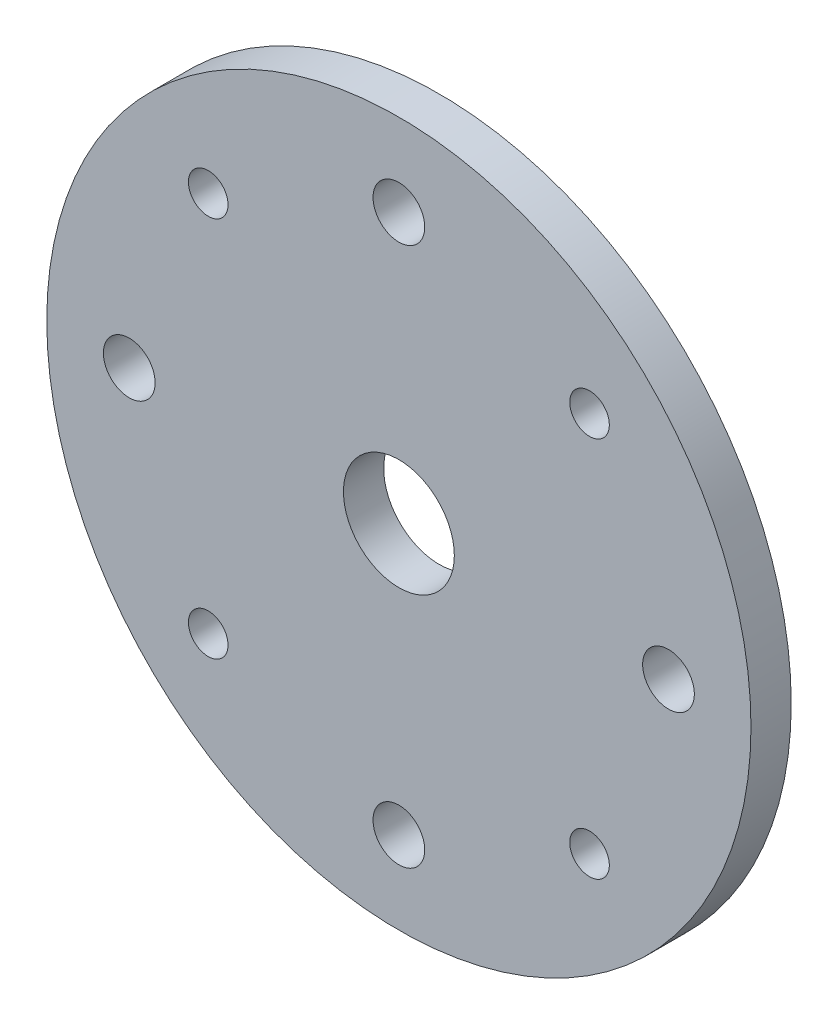
ISO-10303-21;
HEADER;
FILE_DESCRIPTION(('STEP AP214'),'2;1');
FILE_NAME('part.step','',(''),(''),'','','');
FILE_SCHEMA(('AUTOMOTIVE_DESIGN { 1 0 10303 214 1 1 1 1 }'));
ENDSEC;
DATA;
#1=APPLICATION_CONTEXT('core data for automotive mechanical design processes');
#2=APPLICATION_PROTOCOL_DEFINITION('international standard','automotive_design',2000,#1);
#3=PRODUCT_CONTEXT('',#1,'mechanical');
#4=PRODUCT('Part','Part','',(#3));
#5=PRODUCT_RELATED_PRODUCT_CATEGORY('part','',(#4));
#6=PRODUCT_DEFINITION_FORMATION('','',#4);
#7=PRODUCT_DEFINITION_CONTEXT('part definition',#1,'design');
#8=PRODUCT_DEFINITION('design','',#6,#7);
#9=PRODUCT_DEFINITION_SHAPE('','',#8);
#10=(LENGTH_UNIT() NAMED_UNIT(*) SI_UNIT(.MILLI.,.METRE.));
#11=(NAMED_UNIT(*) PLANE_ANGLE_UNIT() SI_UNIT($,.RADIAN.));
#12=(NAMED_UNIT(*) SI_UNIT($,.STERADIAN.) SOLID_ANGLE_UNIT());
#13=UNCERTAINTY_MEASURE_WITH_UNIT(LENGTH_MEASURE(1.E-05),#10,'distance_accuracy_value','');
#14=(GEOMETRIC_REPRESENTATION_CONTEXT(3) GLOBAL_UNCERTAINTY_ASSIGNED_CONTEXT((#13)) GLOBAL_UNIT_ASSIGNED_CONTEXT((#10,
#11,#12)) REPRESENTATION_CONTEXT('',''));
#15=CARTESIAN_POINT('',(0.,0.,0.));
#16=DIRECTION('',(0.,0.,1.));
#17=DIRECTION('',(1.,0.,0.));
#18=AXIS2_PLACEMENT_3D('',#15,#16,#17);
#19=CARTESIAN_POINT('',(0.,0.,5.08));
#20=DIRECTION('',(0.,0.,1.));
#21=DIRECTION('',(1.,0.,0.));
#22=AXIS2_PLACEMENT_3D('',#19,#20,#21);
#23=PLANE('',#22);
#24=CARTESIAN_POINT('',(-24.0670864044629,-24.0670864044664,5.08));
#25=DIRECTION('',(0.,0.,1.));
#26=DIRECTION('',(1.,0.,0.));
#27=AXIS2_PLACEMENT_3D('',#24,#25,#26);
#28=CIRCLE('',#27,2.50000000000295);
#29=CARTESIAN_POINT('',(-21.5670864044599,-24.0670864044664,5.08));
#30=VERTEX_POINT('',#29);
#31=EDGE_CURVE('E82',#30,#30,#28,.T.);
#32=ORIENTED_EDGE('',*,*,#31,.F.);
#33=EDGE_LOOP('',(#32));
#34=FACE_BOUND('',#33,.T.);
#35=CARTESIAN_POINT('',(24.0670864044658,24.0670864044664,5.08));
#36=DIRECTION('',(0.,0.,1.));
#37=DIRECTION('',(1.,0.,0.));
#38=AXIS2_PLACEMENT_3D('',#35,#36,#37);
#39=CIRCLE('',#38,2.50000000000017);
#40=CARTESIAN_POINT('',(26.5670864044659,24.0670864044664,5.08));
#41=VERTEX_POINT('',#40);
#42=EDGE_CURVE('E70',#41,#41,#39,.T.);
#43=ORIENTED_EDGE('',*,*,#42,.F.);
#44=EDGE_LOOP('',(#43));
#45=FACE_BOUND('',#44,.T.);
#46=CARTESIAN_POINT('',(2.89374749082854E-12,-34.036,5.08));
#47=DIRECTION('',(0.,0.,1.));
#48=DIRECTION('',(1.,0.,0.));
#49=AXIS2_PLACEMENT_3D('',#46,#47,#48);
#50=CIRCLE('',#49,3.2639);
#51=CARTESIAN_POINT('',(3.2639000000029,-34.036,5.08));
#52=VERTEX_POINT('',#51);
#53=EDGE_CURVE('E58',#52,#52,#50,.T.);
#54=ORIENTED_EDGE('',*,*,#53,.F.);
#55=EDGE_LOOP('',(#54));
#56=FACE_BOUND('',#55,.T.);
#57=CARTESIAN_POINT('',(0.,34.036,5.08));
#58=DIRECTION('',(0.,0.,1.));
#59=DIRECTION('',(1.,0.,0.));
#60=AXIS2_PLACEMENT_3D('',#57,#58,#59);
#61=CIRCLE('',#60,3.2639);
#62=CARTESIAN_POINT('',(3.2639,34.036,5.08));
#63=VERTEX_POINT('',#62);
#64=EDGE_CURVE('E46',#63,#63,#61,.T.);
#65=ORIENTED_EDGE('',*,*,#64,.F.);
#66=EDGE_LOOP('',(#65));
#67=FACE_BOUND('',#66,.T.);
#68=CARTESIAN_POINT('',(0.,0.,5.08));
#69=DIRECTION('',(0.,0.,1.));
#70=DIRECTION('',(1.,0.,0.));
#71=AXIS2_PLACEMENT_3D('',#68,#69,#70);
#72=CIRCLE('',#71,44.45);
#73=CARTESIAN_POINT('',(44.45,0.,5.08));
#74=VERTEX_POINT('',#73);
#75=EDGE_CURVE('E10',#74,#74,#72,.T.);
#76=ORIENTED_EDGE('',*,*,#75,.T.);
#77=EDGE_LOOP('',(#76));
#78=FACE_BOUND('',#77,.T.);
#79=CARTESIAN_POINT('',(0.,0.,5.08));
#80=DIRECTION('',(0.,0.,1.));
#81=DIRECTION('',(1.,0.,0.));
#82=AXIS2_PLACEMENT_3D('',#79,#80,#81);
#83=CIRCLE('',#82,6.9999987);
#84=CARTESIAN_POINT('',(6.9999987,0.,5.08));
#85=VERTEX_POINT('',#84);
#86=EDGE_CURVE('E41',#85,#85,#83,.T.);
#87=ORIENTED_EDGE('',*,*,#86,.F.);
#88=EDGE_LOOP('',(#87));
#89=FACE_BOUND('',#88,.T.);
#90=CARTESIAN_POINT('',(34.0360000000014,1.44687374541427E-12,5.08));
#91=DIRECTION('',(0.,0.,1.));
#92=DIRECTION('',(1.,0.,0.));
#93=AXIS2_PLACEMENT_3D('',#90,#91,#92);
#94=CIRCLE('',#93,3.2639);
#95=CARTESIAN_POINT('',(37.2999000000015,1.44687374541427E-12,5.08));
#96=VERTEX_POINT('',#95);
#97=EDGE_CURVE('E52',#96,#96,#94,.T.);
#98=ORIENTED_EDGE('',*,*,#97,.F.);
#99=EDGE_LOOP('',(#98));
#100=FACE_BOUND('',#99,.T.);
#101=CARTESIAN_POINT('',(-34.0359999999986,-1.45104195325985E-12,5.08));
#102=DIRECTION('',(0.,0.,1.));
#103=DIRECTION('',(1.,0.,0.));
#104=AXIS2_PLACEMENT_3D('',#101,#102,#103);
#105=CIRCLE('',#104,3.2639);
#106=CARTESIAN_POINT('',(-30.7720999999986,-1.45104195325985E-12,5.08));
#107=VERTEX_POINT('',#106);
#108=EDGE_CURVE('E64',#107,#107,#105,.T.);
#109=ORIENTED_EDGE('',*,*,#108,.F.);
#110=EDGE_LOOP('',(#109));
#111=FACE_BOUND('',#110,.T.);
#112=CARTESIAN_POINT('',(24.0670864044678,-24.0670864044643,5.08));
#113=DIRECTION('',(0.,0.,1.));
#114=DIRECTION('',(1.,0.,0.));
#115=AXIS2_PLACEMENT_3D('',#112,#113,#114);
#116=CIRCLE('',#115,2.50000000000224);
#117=CARTESIAN_POINT('',(26.56708640447,-24.0670864044643,5.08));
#118=VERTEX_POINT('',#117);
#119=EDGE_CURVE('E76',#118,#118,#116,.T.);
#120=ORIENTED_EDGE('',*,*,#119,.F.);
#121=EDGE_LOOP('',(#120));
#122=FACE_BOUND('',#121,.T.);
#123=CARTESIAN_POINT('',(-24.0670864044649,24.0670864044643,5.08));
#124=DIRECTION('',(0.,0.,1.));
#125=DIRECTION('',(1.,0.,0.));
#126=AXIS2_PLACEMENT_3D('',#123,#124,#125);
#127=CIRCLE('',#126,2.50000000000111);
#128=CARTESIAN_POINT('',(-21.5670864044638,24.0670864044643,5.08));
#129=VERTEX_POINT('',#128);
#130=EDGE_CURVE('E88',#129,#129,#127,.T.);
#131=ORIENTED_EDGE('',*,*,#130,.F.);
#132=EDGE_LOOP('',(#131));
#133=FACE_BOUND('',#132,.T.);
#134=ADVANCED_FACE('F30',(#34,#45,#56,#67,#78,#89,#100,#111,#122,#133),#23,.T.);
#135=CARTESIAN_POINT('',(0.,0.,0.));
#136=DIRECTION('',(0.,0.,1.));
#137=DIRECTION('',(1.,0.,0.));
#138=AXIS2_PLACEMENT_3D('',#135,#136,#137);
#139=PLANE('',#138);
#140=CARTESIAN_POINT('',(0.,0.,0.));
#141=DIRECTION('',(0.,0.,1.));
#142=DIRECTION('',(1.,0.,0.));
#143=AXIS2_PLACEMENT_3D('',#140,#141,#142);
#144=CIRCLE('',#143,44.45);
#145=CARTESIAN_POINT('',(44.45,0.,0.));
#146=VERTEX_POINT('',#145);
#147=EDGE_CURVE('E34',#146,#146,#144,.T.);
#148=ORIENTED_EDGE('',*,*,#147,.F.);
#149=EDGE_LOOP('',(#148));
#150=FACE_BOUND('',#149,.T.);
#151=CARTESIAN_POINT('',(0.,0.,0.));
#152=DIRECTION('',(0.,0.,1.));
#153=DIRECTION('',(1.,0.,0.));
#154=AXIS2_PLACEMENT_3D('',#151,#152,#153);
#155=CIRCLE('',#154,6.9999987);
#156=CARTESIAN_POINT('',(6.9999987,0.,0.));
#157=VERTEX_POINT('',#156);
#158=EDGE_CURVE('E43',#157,#157,#155,.T.);
#159=ORIENTED_EDGE('',*,*,#158,.T.);
#160=EDGE_LOOP('',(#159));
#161=FACE_BOUND('',#160,.T.);
#162=CARTESIAN_POINT('',(0.,34.036,0.));
#163=DIRECTION('',(0.,0.,1.));
#164=DIRECTION('',(1.,0.,0.));
#165=AXIS2_PLACEMENT_3D('',#162,#163,#164);
#166=CIRCLE('',#165,3.2639);
#167=CARTESIAN_POINT('',(3.2639,34.036,0.));
#168=VERTEX_POINT('',#167);
#169=EDGE_CURVE('E49',#168,#168,#166,.T.);
#170=ORIENTED_EDGE('',*,*,#169,.T.);
#171=EDGE_LOOP('',(#170));
#172=FACE_BOUND('',#171,.T.);
#173=CARTESIAN_POINT('',(34.0360000000014,1.44687374541427E-12,0.));
#174=DIRECTION('',(0.,0.,1.));
#175=DIRECTION('',(1.,0.,0.));
#176=AXIS2_PLACEMENT_3D('',#173,#174,#175);
#177=CIRCLE('',#176,3.2639);
#178=CARTESIAN_POINT('',(37.2999000000015,1.44687374541427E-12,0.));
#179=VERTEX_POINT('',#178);
#180=EDGE_CURVE('E55',#179,#179,#177,.T.);
#181=ORIENTED_EDGE('',*,*,#180,.T.);
#182=EDGE_LOOP('',(#181));
#183=FACE_BOUND('',#182,.T.);
#184=CARTESIAN_POINT('',(2.89374749082854E-12,-34.036,0.));
#185=DIRECTION('',(0.,0.,1.));
#186=DIRECTION('',(1.,0.,0.));
#187=AXIS2_PLACEMENT_3D('',#184,#185,#186);
#188=CIRCLE('',#187,3.2639);
#189=CARTESIAN_POINT('',(3.2639000000029,-34.036,0.));
#190=VERTEX_POINT('',#189);
#191=EDGE_CURVE('E61',#190,#190,#188,.T.);
#192=ORIENTED_EDGE('',*,*,#191,.T.);
#193=EDGE_LOOP('',(#192));
#194=FACE_BOUND('',#193,.T.);
#195=CARTESIAN_POINT('',(-34.0359999999986,-1.45104195325985E-12,0.));
#196=DIRECTION('',(0.,0.,1.));
#197=DIRECTION('',(1.,0.,0.));
#198=AXIS2_PLACEMENT_3D('',#195,#196,#197);
#199=CIRCLE('',#198,3.2639);
#200=CARTESIAN_POINT('',(-30.7720999999986,-1.45104195325985E-12,0.));
#201=VERTEX_POINT('',#200);
#202=EDGE_CURVE('E67',#201,#201,#199,.T.);
#203=ORIENTED_EDGE('',*,*,#202,.T.);
#204=EDGE_LOOP('',(#203));
#205=FACE_BOUND('',#204,.T.);
#206=CARTESIAN_POINT('',(24.0670864044658,24.0670864044664,0.));
#207=DIRECTION('',(0.,0.,1.));
#208=DIRECTION('',(1.,0.,0.));
#209=AXIS2_PLACEMENT_3D('',#206,#207,#208);
#210=CIRCLE('',#209,2.50000000000017);
#211=CARTESIAN_POINT('',(26.5670864044659,24.0670864044664,0.));
#212=VERTEX_POINT('',#211);
#213=EDGE_CURVE('E73',#212,#212,#210,.T.);
#214=ORIENTED_EDGE('',*,*,#213,.T.);
#215=EDGE_LOOP('',(#214));
#216=FACE_BOUND('',#215,.T.);
#217=CARTESIAN_POINT('',(24.0670864044678,-24.0670864044643,0.));
#218=DIRECTION('',(0.,0.,1.));
#219=DIRECTION('',(1.,0.,0.));
#220=AXIS2_PLACEMENT_3D('',#217,#218,#219);
#221=CIRCLE('',#220,2.50000000000224);
#222=CARTESIAN_POINT('',(26.56708640447,-24.0670864044643,0.));
#223=VERTEX_POINT('',#222);
#224=EDGE_CURVE('E79',#223,#223,#221,.T.);
#225=ORIENTED_EDGE('',*,*,#224,.T.);
#226=EDGE_LOOP('',(#225));
#227=FACE_BOUND('',#226,.T.);
#228=CARTESIAN_POINT('',(-24.0670864044629,-24.0670864044664,0.));
#229=DIRECTION('',(0.,0.,1.));
#230=DIRECTION('',(1.,0.,0.));
#231=AXIS2_PLACEMENT_3D('',#228,#229,#230);
#232=CIRCLE('',#231,2.50000000000295);
#233=CARTESIAN_POINT('',(-21.5670864044599,-24.0670864044664,0.));
#234=VERTEX_POINT('',#233);
#235=EDGE_CURVE('E85',#234,#234,#232,.T.);
#236=ORIENTED_EDGE('',*,*,#235,.T.);
#237=EDGE_LOOP('',(#236));
#238=FACE_BOUND('',#237,.T.);
#239=CARTESIAN_POINT('',(-24.0670864044649,24.0670864044643,0.));
#240=DIRECTION('',(0.,0.,1.));
#241=DIRECTION('',(1.,0.,0.));
#242=AXIS2_PLACEMENT_3D('',#239,#240,#241);
#243=CIRCLE('',#242,2.50000000000111);
#244=CARTESIAN_POINT('',(-21.5670864044638,24.0670864044643,0.));
#245=VERTEX_POINT('',#244);
#246=EDGE_CURVE('E91',#245,#245,#243,.T.);
#247=ORIENTED_EDGE('',*,*,#246,.T.);
#248=EDGE_LOOP('',(#247));
#249=FACE_BOUND('',#248,.T.);
#250=ADVANCED_FACE('F101',(#150,#161,#172,#183,#194,#205,#216,#227,#238,#249),#139,.F.);
#251=CARTESIAN_POINT('',(0.,0.,5.08));
#252=DIRECTION('',(0.,0.,-1.));
#253=DIRECTION('',(-1.,0.,0.));
#254=AXIS2_PLACEMENT_3D('',#251,#252,#253);
#255=CYLINDRICAL_SURFACE('',#254,44.45);
#256=ORIENTED_EDGE('',*,*,#75,.F.);
#257=EDGE_LOOP('',(#256));
#258=FACE_BOUND('',#257,.T.);
#259=ORIENTED_EDGE('',*,*,#147,.T.);
#260=EDGE_LOOP('',(#259));
#261=FACE_BOUND('',#260,.T.);
#262=ADVANCED_FACE('F32',(#258,#261),#255,.T.);
#263=CARTESIAN_POINT('',(0.,0.,5.08));
#264=DIRECTION('',(0.,0.,-1.));
#265=DIRECTION('',(-1.,0.,0.));
#266=AXIS2_PLACEMENT_3D('',#263,#264,#265);
#267=CYLINDRICAL_SURFACE('',#266,6.9999987);
#268=ORIENTED_EDGE('',*,*,#86,.T.);
#269=EDGE_LOOP('',(#268));
#270=FACE_BOUND('',#269,.T.);
#271=ORIENTED_EDGE('',*,*,#158,.F.);
#272=EDGE_LOOP('',(#271));
#273=FACE_BOUND('',#272,.T.);
#274=ADVANCED_FACE('F111',(#270,#273),#267,.F.);
#275=CARTESIAN_POINT('',(0.,34.036,5.08));
#276=DIRECTION('',(0.,0.,-1.));
#277=DIRECTION('',(-1.,0.,0.));
#278=AXIS2_PLACEMENT_3D('',#275,#276,#277);
#279=CYLINDRICAL_SURFACE('',#278,3.2639);
#280=ORIENTED_EDGE('',*,*,#64,.T.);
#281=EDGE_LOOP('',(#280));
#282=FACE_BOUND('',#281,.T.);
#283=ORIENTED_EDGE('',*,*,#169,.F.);
#284=EDGE_LOOP('',(#283));
#285=FACE_BOUND('',#284,.T.);
#286=ADVANCED_FACE('F114',(#282,#285),#279,.F.);
#287=CARTESIAN_POINT('',(34.0360000000014,1.44687374541427E-12,5.08));
#288=DIRECTION('',(0.,0.,-1.));
#289=DIRECTION('',(-1.,0.,0.));
#290=AXIS2_PLACEMENT_3D('',#287,#288,#289);
#291=CYLINDRICAL_SURFACE('',#290,3.2639);
#292=ORIENTED_EDGE('',*,*,#97,.T.);
#293=EDGE_LOOP('',(#292));
#294=FACE_BOUND('',#293,.T.);
#295=ORIENTED_EDGE('',*,*,#180,.F.);
#296=EDGE_LOOP('',(#295));
#297=FACE_BOUND('',#296,.T.);
#298=ADVANCED_FACE('F118',(#294,#297),#291,.F.);
#299=CARTESIAN_POINT('',(2.89374749082854E-12,-34.036,5.08));
#300=DIRECTION('',(0.,0.,-1.));
#301=DIRECTION('',(-1.,0.,0.));
#302=AXIS2_PLACEMENT_3D('',#299,#300,#301);
#303=CYLINDRICAL_SURFACE('',#302,3.2639);
#304=ORIENTED_EDGE('',*,*,#53,.T.);
#305=EDGE_LOOP('',(#304));
#306=FACE_BOUND('',#305,.T.);
#307=ORIENTED_EDGE('',*,*,#191,.F.);
#308=EDGE_LOOP('',(#307));
#309=FACE_BOUND('',#308,.T.);
#310=ADVANCED_FACE('F122',(#306,#309),#303,.F.);
#311=CARTESIAN_POINT('',(-34.0359999999986,-1.45104195325985E-12,5.08));
#312=DIRECTION('',(0.,0.,-1.));
#313=DIRECTION('',(-1.,0.,0.));
#314=AXIS2_PLACEMENT_3D('',#311,#312,#313);
#315=CYLINDRICAL_SURFACE('',#314,3.2639);
#316=ORIENTED_EDGE('',*,*,#108,.T.);
#317=EDGE_LOOP('',(#316));
#318=FACE_BOUND('',#317,.T.);
#319=ORIENTED_EDGE('',*,*,#202,.F.);
#320=EDGE_LOOP('',(#319));
#321=FACE_BOUND('',#320,.T.);
#322=ADVANCED_FACE('F126',(#318,#321),#315,.F.);
#323=CARTESIAN_POINT('',(24.0670864044658,24.0670864044664,5.08));
#324=DIRECTION('',(0.,0.,-1.));
#325=DIRECTION('',(-1.,0.,0.));
#326=AXIS2_PLACEMENT_3D('',#323,#324,#325);
#327=CYLINDRICAL_SURFACE('',#326,2.50000000000017);
#328=ORIENTED_EDGE('',*,*,#42,.T.);
#329=EDGE_LOOP('',(#328));
#330=FACE_BOUND('',#329,.T.);
#331=ORIENTED_EDGE('',*,*,#213,.F.);
#332=EDGE_LOOP('',(#331));
#333=FACE_BOUND('',#332,.T.);
#334=ADVANCED_FACE('F130',(#330,#333),#327,.F.);
#335=CARTESIAN_POINT('',(24.0670864044678,-24.0670864044643,5.08));
#336=DIRECTION('',(0.,0.,-1.));
#337=DIRECTION('',(-1.,0.,0.));
#338=AXIS2_PLACEMENT_3D('',#335,#336,#337);
#339=CYLINDRICAL_SURFACE('',#338,2.50000000000224);
#340=ORIENTED_EDGE('',*,*,#119,.T.);
#341=EDGE_LOOP('',(#340));
#342=FACE_BOUND('',#341,.T.);
#343=ORIENTED_EDGE('',*,*,#224,.F.);
#344=EDGE_LOOP('',(#343));
#345=FACE_BOUND('',#344,.T.);
#346=ADVANCED_FACE('F134',(#342,#345),#339,.F.);
#347=CARTESIAN_POINT('',(-24.0670864044629,-24.0670864044664,5.08));
#348=DIRECTION('',(0.,0.,-1.));
#349=DIRECTION('',(-1.,0.,0.));
#350=AXIS2_PLACEMENT_3D('',#347,#348,#349);
#351=CYLINDRICAL_SURFACE('',#350,2.50000000000295);
#352=ORIENTED_EDGE('',*,*,#31,.T.);
#353=EDGE_LOOP('',(#352));
#354=FACE_BOUND('',#353,.T.);
#355=ORIENTED_EDGE('',*,*,#235,.F.);
#356=EDGE_LOOP('',(#355));
#357=FACE_BOUND('',#356,.T.);
#358=ADVANCED_FACE('F138',(#354,#357),#351,.F.);
#359=CARTESIAN_POINT('',(-24.0670864044649,24.0670864044643,5.08));
#360=DIRECTION('',(0.,0.,-1.));
#361=DIRECTION('',(-1.,0.,0.));
#362=AXIS2_PLACEMENT_3D('',#359,#360,#361);
#363=CYLINDRICAL_SURFACE('',#362,2.50000000000111);
#364=ORIENTED_EDGE('',*,*,#130,.T.);
#365=EDGE_LOOP('',(#364));
#366=FACE_BOUND('',#365,.T.);
#367=ORIENTED_EDGE('',*,*,#246,.F.);
#368=EDGE_LOOP('',(#367));
#369=FACE_BOUND('',#368,.T.);
#370=ADVANCED_FACE('F97',(#366,#369),#363,.F.);
#371=CLOSED_SHELL('',(#134,#250,#262,#274,#286,#298,#310,#322,#334,#346,#358,#370));
#372=MANIFOLD_SOLID_BREP('B2',#371);
#373=ADVANCED_BREP_SHAPE_REPRESENTATION('',(#18,#372),#14);
#374=SHAPE_DEFINITION_REPRESENTATION(#9,#373);
ENDSEC;
END-ISO-10303-21;
